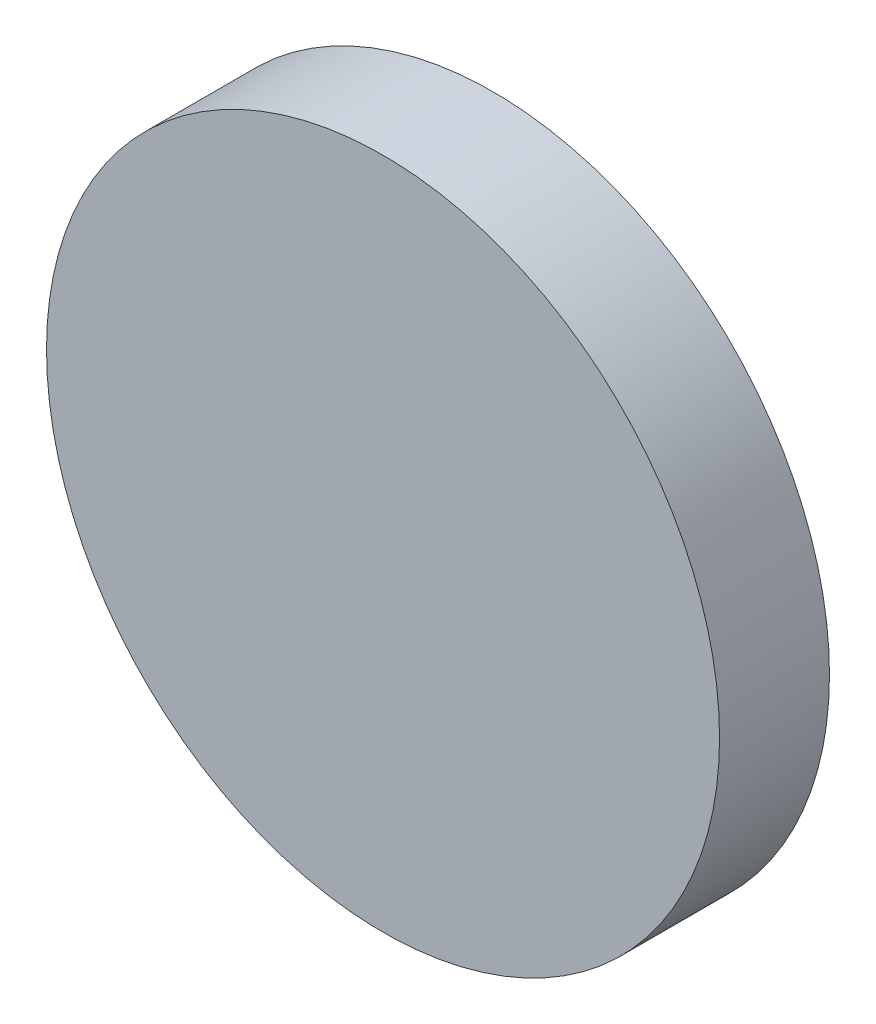
ISO-10303-21;
HEADER;
FILE_DESCRIPTION(('STEP AP214'),'2;1');
FILE_NAME('part.step','',(''),(''),'','','');
FILE_SCHEMA(('AUTOMOTIVE_DESIGN { 1 0 10303 214 1 1 1 1 }'));
ENDSEC;
DATA;
#1=APPLICATION_CONTEXT('core data for automotive mechanical design processes');
#2=APPLICATION_PROTOCOL_DEFINITION('international standard','automotive_design',2000,#1);
#3=PRODUCT_CONTEXT('',#1,'mechanical');
#4=PRODUCT('Part','Part','',(#3));
#5=PRODUCT_RELATED_PRODUCT_CATEGORY('part','',(#4));
#6=PRODUCT_DEFINITION_FORMATION('','',#4);
#7=PRODUCT_DEFINITION_CONTEXT('part definition',#1,'design');
#8=PRODUCT_DEFINITION('design','',#6,#7);
#9=PRODUCT_DEFINITION_SHAPE('','',#8);
#10=(LENGTH_UNIT() NAMED_UNIT(*) SI_UNIT(.MILLI.,.METRE.));
#11=(NAMED_UNIT(*) PLANE_ANGLE_UNIT() SI_UNIT($,.RADIAN.));
#12=(NAMED_UNIT(*) SI_UNIT($,.STERADIAN.) SOLID_ANGLE_UNIT());
#13=UNCERTAINTY_MEASURE_WITH_UNIT(LENGTH_MEASURE(1.E-05),#10,'distance_accuracy_value','');
#14=(GEOMETRIC_REPRESENTATION_CONTEXT(3) GLOBAL_UNCERTAINTY_ASSIGNED_CONTEXT((#13)) GLOBAL_UNIT_ASSIGNED_CONTEXT((#10,
#11,#12)) REPRESENTATION_CONTEXT('',''));
#15=CARTESIAN_POINT('',(0.,0.,0.));
#16=DIRECTION('',(0.,0.,1.));
#17=DIRECTION('',(1.,0.,0.));
#18=AXIS2_PLACEMENT_3D('',#15,#16,#17);
#19=CARTESIAN_POINT('',(0.,0.,4.9));
#20=DIRECTION('',(0.,0.,-1.));
#21=DIRECTION('',(-1.,0.,0.));
#22=AXIS2_PLACEMENT_3D('',#19,#20,#21);
#23=CYLINDRICAL_SURFACE('',#22,15.);
#24=CARTESIAN_POINT('',(0.,0.,4.9));
#25=DIRECTION('',(0.,0.,1.));
#26=DIRECTION('',(1.,0.,0.));
#27=AXIS2_PLACEMENT_3D('',#24,#25,#26);
#28=CIRCLE('',#27,15.);
#29=CARTESIAN_POINT('',(15.,0.,4.9));
#30=VERTEX_POINT('',#29);
#31=EDGE_CURVE('E10',#30,#30,#28,.T.);
#32=ORIENTED_EDGE('',*,*,#31,.F.);
#33=EDGE_LOOP('',(#32));
#34=FACE_BOUND('',#33,.T.);
#35=CARTESIAN_POINT('',(0.,0.,0.));
#36=DIRECTION('',(0.,0.,1.));
#37=DIRECTION('',(1.,0.,0.));
#38=AXIS2_PLACEMENT_3D('',#35,#36,#37);
#39=CIRCLE('',#38,15.);
#40=CARTESIAN_POINT('',(15.,0.,0.));
#41=VERTEX_POINT('',#40);
#42=EDGE_CURVE('E45',#41,#41,#39,.T.);
#43=ORIENTED_EDGE('',*,*,#42,.T.);
#44=EDGE_LOOP('',(#43));
#45=FACE_BOUND('',#44,.T.);
#46=ADVANCED_FACE('F39',(#34,#45),#23,.T.);
#47=CARTESIAN_POINT('',(0.,0.,4.9));
#48=DIRECTION('',(0.,0.,1.));
#49=DIRECTION('',(1.,0.,0.));
#50=AXIS2_PLACEMENT_3D('',#47,#48,#49);
#51=PLANE('',#50);
#52=ORIENTED_EDGE('',*,*,#31,.T.);
#53=EDGE_LOOP('',(#52));
#54=FACE_BOUND('',#53,.T.);
#55=ADVANCED_FACE('F53',(#54),#51,.T.);
#56=CARTESIAN_POINT('',(0.,0.,0.));
#57=DIRECTION('',(0.,0.,1.));
#58=DIRECTION('',(1.,0.,0.));
#59=AXIS2_PLACEMENT_3D('',#56,#57,#58);
#60=PLANE('',#59);
#61=ORIENTED_EDGE('',*,*,#42,.F.);
#62=EDGE_LOOP('',(#61));
#63=FACE_BOUND('',#62,.T.);
#64=ADVANCED_FACE('F55',(#63),#60,.F.);
#65=CLOSED_SHELL('',(#46,#55,#64));
#66=MANIFOLD_SOLID_BREP('B2',#65);
#67=ADVANCED_BREP_SHAPE_REPRESENTATION('',(#18,#66),#14);
#68=SHAPE_DEFINITION_REPRESENTATION(#9,#67);
ENDSEC;
END-ISO-10303-21;
